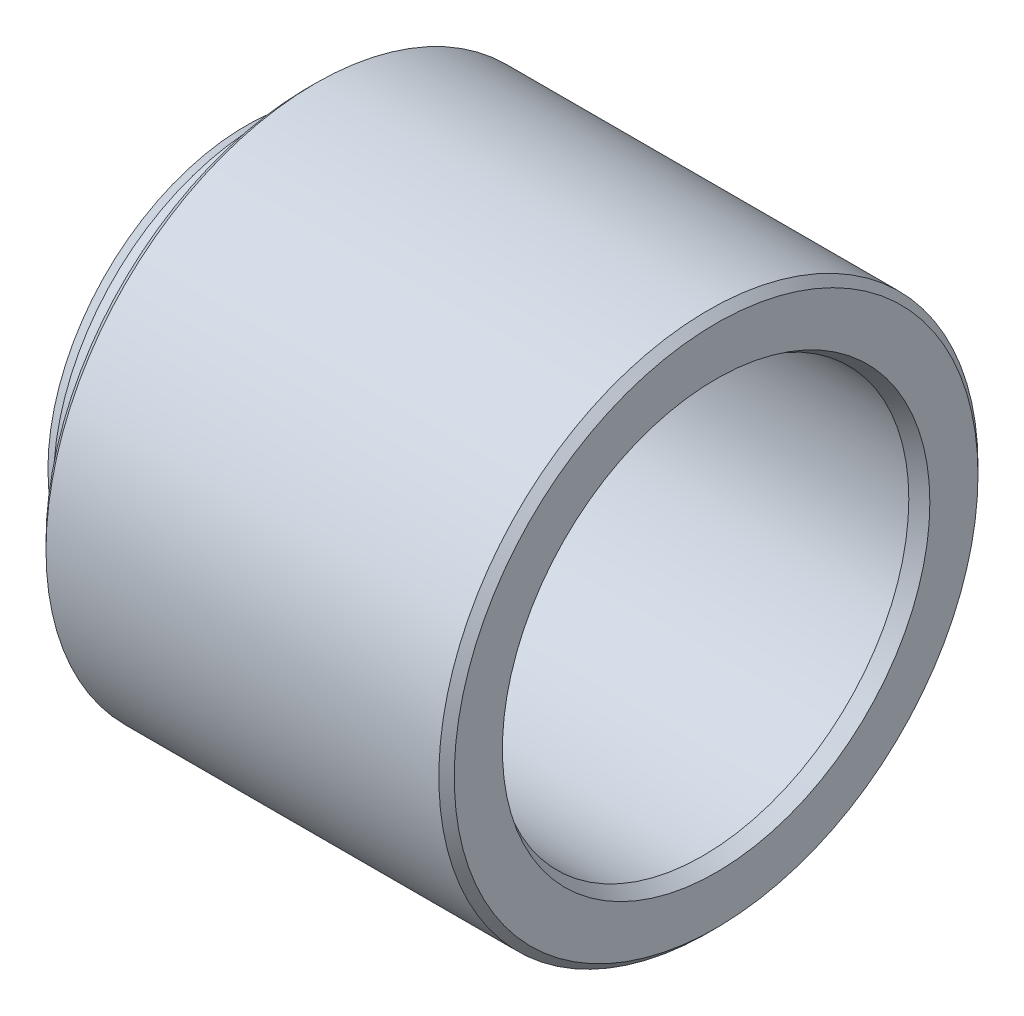
ISO-10303-21;
HEADER;
FILE_DESCRIPTION(('STEP AP214'),'2;1');
FILE_NAME('part.step','',(''),(''),'','','');
FILE_SCHEMA(('AUTOMOTIVE_DESIGN { 1 0 10303 214 1 1 1 1 }'));
ENDSEC;
DATA;
#1=APPLICATION_CONTEXT('core data for automotive mechanical design processes');
#2=APPLICATION_PROTOCOL_DEFINITION('international standard','automotive_design',2000,#1);
#3=PRODUCT_CONTEXT('',#1,'mechanical');
#4=PRODUCT('Part','Part','',(#3));
#5=PRODUCT_RELATED_PRODUCT_CATEGORY('part','',(#4));
#6=PRODUCT_DEFINITION_FORMATION('','',#4);
#7=PRODUCT_DEFINITION_CONTEXT('part definition',#1,'design');
#8=PRODUCT_DEFINITION('design','',#6,#7);
#9=PRODUCT_DEFINITION_SHAPE('','',#8);
#10=(LENGTH_UNIT() NAMED_UNIT(*) SI_UNIT(.MILLI.,.METRE.));
#11=(NAMED_UNIT(*) PLANE_ANGLE_UNIT() SI_UNIT($,.RADIAN.));
#12=(NAMED_UNIT(*) SI_UNIT($,.STERADIAN.) SOLID_ANGLE_UNIT());
#13=UNCERTAINTY_MEASURE_WITH_UNIT(LENGTH_MEASURE(1.E-05),#10,'distance_accuracy_value','');
#14=(GEOMETRIC_REPRESENTATION_CONTEXT(3) GLOBAL_UNCERTAINTY_ASSIGNED_CONTEXT((#13)) GLOBAL_UNIT_ASSIGNED_CONTEXT((#10,
#11,#12)) REPRESENTATION_CONTEXT('',''));
#15=CARTESIAN_POINT('',(0.,0.,0.));
#16=DIRECTION('',(0.,0.,1.));
#17=DIRECTION('',(1.,0.,0.));
#18=AXIS2_PLACEMENT_3D('',#15,#16,#17);
#19=CARTESIAN_POINT('',(0.,8.89,0.));
#20=DIRECTION('',(1.,0.,0.));
#21=DIRECTION('',(0.,0.,-1.));
#22=AXIS2_PLACEMENT_3D('',#19,#20,#21);
#23=PLANE('',#22);
#24=CARTESIAN_POINT('',(0.,0.,0.));
#25=DIRECTION('',(1.,0.,0.));
#26=DIRECTION('',(0.,0.,-1.));
#27=AXIS2_PLACEMENT_3D('',#24,#25,#26);
#28=CIRCLE('',#27,7.0485);
#29=CARTESIAN_POINT('',(0.,0.,-7.0485));
#30=VERTEX_POINT('',#29);
#31=EDGE_CURVE('E25',#30,#30,#28,.F.);
#32=ORIENTED_EDGE('',*,*,#31,.T.);
#33=EDGE_LOOP('',(#32));
#34=FACE_BOUND('',#33,.T.);
#35=CARTESIAN_POINT('',(0.,0.,0.));
#36=DIRECTION('',(1.,0.,0.));
#37=DIRECTION('',(0.,0.,-1.));
#38=AXIS2_PLACEMENT_3D('',#35,#36,#37);
#39=CIRCLE('',#38,8.63599999999999);
#40=CARTESIAN_POINT('',(0.,0.,-8.63599999999999));
#41=VERTEX_POINT('',#40);
#42=EDGE_CURVE('E34',#41,#41,#39,.T.);
#43=ORIENTED_EDGE('',*,*,#42,.T.);
#44=EDGE_LOOP('',(#43));
#45=FACE_BOUND('',#44,.T.);
#46=ADVANCED_FACE('F14',(#34,#45),#23,.T.);
#47=CARTESIAN_POINT('',(0.,0.,0.));
#48=DIRECTION('',(1.,0.,0.));
#49=DIRECTION('',(0.,0.,-1.));
#50=AXIS2_PLACEMENT_3D('',#47,#48,#49);
#51=CYLINDRICAL_SURFACE('',#50,8.89);
#52=CARTESIAN_POINT('',(-13.208,0.,0.));
#53=DIRECTION('',(-1.,0.,0.));
#54=DIRECTION('',(0.,0.,1.));
#55=AXIS2_PLACEMENT_3D('',#52,#53,#54);
#56=CIRCLE('',#55,8.89);
#57=CARTESIAN_POINT('',(-13.208,0.,8.89));
#58=VERTEX_POINT('',#57);
#59=EDGE_CURVE('E40',#58,#58,#56,.F.);
#60=ORIENTED_EDGE('',*,*,#59,.T.);
#61=EDGE_LOOP('',(#60));
#62=FACE_BOUND('',#61,.T.);
#63=CARTESIAN_POINT('',(-0.254000000000006,0.,0.));
#64=DIRECTION('',(1.,0.,0.));
#65=DIRECTION('',(0.,0.,-1.));
#66=AXIS2_PLACEMENT_3D('',#63,#64,#65);
#67=CIRCLE('',#66,8.89);
#68=CARTESIAN_POINT('',(-0.254000000000006,0.,-8.89));
#69=VERTEX_POINT('',#68);
#70=EDGE_CURVE('E43',#69,#69,#67,.F.);
#71=ORIENTED_EDGE('',*,*,#70,.T.);
#72=EDGE_LOOP('',(#71));
#73=FACE_BOUND('',#72,.T.);
#74=ADVANCED_FACE('F93',(#62,#73),#51,.T.);
#75=CARTESIAN_POINT('',(-13.462,8.89,0.));
#76=DIRECTION('',(-1.,0.,0.));
#77=DIRECTION('',(0.,0.,1.));
#78=AXIS2_PLACEMENT_3D('',#75,#76,#77);
#79=PLANE('',#78);
#80=CARTESIAN_POINT('',(-13.462,0.,0.));
#81=DIRECTION('',(-1.,0.,0.));
#82=DIRECTION('',(0.,0.,1.));
#83=AXIS2_PLACEMENT_3D('',#80,#81,#82);
#84=CIRCLE('',#83,8.636);
#85=CARTESIAN_POINT('',(-13.462,0.,8.636));
#86=VERTEX_POINT('',#85);
#87=EDGE_CURVE('E37',#86,#86,#84,.T.);
#88=ORIENTED_EDGE('',*,*,#87,.T.);
#89=EDGE_LOOP('',(#88));
#90=FACE_BOUND('',#89,.T.);
#91=CARTESIAN_POINT('',(-13.462,0.,0.));
#92=DIRECTION('',(1.,0.,0.));
#93=DIRECTION('',(0.,0.,-1.));
#94=AXIS2_PLACEMENT_3D('',#91,#92,#93);
#95=CIRCLE('',#94,6.4135);
#96=CARTESIAN_POINT('',(-13.462,0.,-6.4135));
#97=VERTEX_POINT('',#96);
#98=EDGE_CURVE('E52',#97,#97,#95,.T.);
#99=ORIENTED_EDGE('',*,*,#98,.T.);
#100=EDGE_LOOP('',(#99));
#101=FACE_BOUND('',#100,.T.);
#102=ADVANCED_FACE('F99',(#90,#101),#79,.T.);
#103=CARTESIAN_POINT('',(0.,0.,0.));
#104=DIRECTION('',(1.,0.,0.));
#105=DIRECTION('',(0.,0.,-1.));
#106=AXIS2_PLACEMENT_3D('',#103,#104,#105);
#107=CYLINDRICAL_SURFACE('',#106,6.4135);
#108=CARTESIAN_POINT('',(-13.843,0.,0.));
#109=DIRECTION('',(1.,0.,0.));
#110=DIRECTION('',(0.,0.,-1.));
#111=AXIS2_PLACEMENT_3D('',#108,#109,#110);
#112=CIRCLE('',#111,6.41349999999999);
#113=CARTESIAN_POINT('',(-13.843,0.,-6.41349999999999));
#114=VERTEX_POINT('',#113);
#115=EDGE_CURVE('E55',#114,#114,#112,.T.);
#116=ORIENTED_EDGE('',*,*,#115,.T.);
#117=EDGE_LOOP('',(#116));
#118=FACE_BOUND('',#117,.T.);
#119=ORIENTED_EDGE('',*,*,#98,.F.);
#120=EDGE_LOOP('',(#119));
#121=FACE_BOUND('',#120,.T.);
#122=ADVANCED_FACE('F226',(#118,#121),#107,.T.);
#123=CARTESIAN_POINT('',(-13.843,0.,0.));
#124=DIRECTION('',(-1.,0.,0.));
#125=DIRECTION('',(0.,0.,1.));
#126=AXIS2_PLACEMENT_3D('',#123,#124,#125);
#127=CONICAL_SURFACE('',#126,6.41349999999999,1.0471975511966);
#128=CARTESIAN_POINT('',(-14.0629704525613,0.,0.));
#129=DIRECTION('',(1.,0.,0.));
#130=DIRECTION('',(0.,0.,-1.));
#131=AXIS2_PLACEMENT_3D('',#128,#129,#130);
#132=CIRCLE('',#131,6.7945);
#133=CARTESIAN_POINT('',(-14.0629704525613,0.,-6.7945));
#134=VERTEX_POINT('',#133);
#135=EDGE_CURVE('E58',#134,#134,#132,.T.);
#136=ORIENTED_EDGE('',*,*,#135,.T.);
#137=EDGE_LOOP('',(#136));
#138=FACE_BOUND('',#137,.T.);
#139=ORIENTED_EDGE('',*,*,#115,.F.);
#140=EDGE_LOOP('',(#139));
#141=FACE_BOUND('',#140,.T.);
#142=ADVANCED_FACE('F218',(#138,#141),#127,.T.);
#143=CARTESIAN_POINT('',(0.,0.,0.));
#144=DIRECTION('',(1.,0.,0.));
#145=DIRECTION('',(0.,0.,-1.));
#146=AXIS2_PLACEMENT_3D('',#143,#144,#145);
#147=CYLINDRICAL_SURFACE('',#146,6.7945);
#148=CARTESIAN_POINT('',(-15.0540590948775,0.,0.));
#149=DIRECTION('',(-1.,0.,0.));
#150=DIRECTION('',(0.,0.,1.));
#151=AXIS2_PLACEMENT_3D('',#148,#149,#150);
#152=CIRCLE('',#151,6.7945);
#153=CARTESIAN_POINT('',(-15.0540590948775,0.,6.7945));
#154=VERTEX_POINT('',#153);
#155=EDGE_CURVE('E21',#154,#154,#152,.F.);
#156=ORIENTED_EDGE('',*,*,#155,.T.);
#157=EDGE_LOOP('',(#156));
#158=FACE_BOUND('',#157,.T.);
#159=ORIENTED_EDGE('',*,*,#135,.F.);
#160=EDGE_LOOP('',(#159));
#161=FACE_BOUND('',#160,.T.);
#162=ADVANCED_FACE('F210',(#158,#161),#147,.T.);
#163=CARTESIAN_POINT('',(-15.494,6.7945,0.));
#164=DIRECTION('',(-1.,0.,0.));
#165=DIRECTION('',(0.,0.,1.));
#166=AXIS2_PLACEMENT_3D('',#163,#164,#165);
#167=PLANE('',#166);
#168=CARTESIAN_POINT('',(-15.494,0.,0.));
#169=DIRECTION('',(-1.,0.,0.));
#170=DIRECTION('',(0.,0.,1.));
#171=AXIS2_PLACEMENT_3D('',#168,#169,#170);
#172=CIRCLE('',#171,6.5405);
#173=CARTESIAN_POINT('',(-15.494,0.,6.5405));
#174=VERTEX_POINT('',#173);
#175=EDGE_CURVE('E10',#174,#174,#172,.T.);
#176=ORIENTED_EDGE('',*,*,#175,.T.);
#177=EDGE_LOOP('',(#176));
#178=FACE_BOUND('',#177,.T.);
#179=CARTESIAN_POINT('',(-15.494,0.,0.));
#180=DIRECTION('',(-1.,0.,0.));
#181=DIRECTION('',(0.,0.,1.));
#182=AXIS2_PLACEMENT_3D('',#179,#180,#181);
#183=CIRCLE('',#182,5.969);
#184=CARTESIAN_POINT('',(-15.494,0.,5.969));
#185=VERTEX_POINT('',#184);
#186=EDGE_CURVE('E49',#185,#185,#183,.F.);
#187=ORIENTED_EDGE('',*,*,#186,.T.);
#188=EDGE_LOOP('',(#187));
#189=FACE_BOUND('',#188,.T.);
#190=ADVANCED_FACE('F200',(#178,#189),#167,.T.);
#191=CARTESIAN_POINT('',(0.,0.,0.));
#192=DIRECTION('',(1.,0.,0.));
#193=DIRECTION('',(0.,0.,-1.));
#194=AXIS2_PLACEMENT_3D('',#191,#192,#193);
#195=CYLINDRICAL_SURFACE('',#194,5.715);
#196=CARTESIAN_POINT('',(-15.24,0.,0.));
#197=DIRECTION('',(-1.,0.,0.));
#198=DIRECTION('',(0.,0.,1.));
#199=AXIS2_PLACEMENT_3D('',#196,#197,#198);
#200=CIRCLE('',#199,5.715);
#201=CARTESIAN_POINT('',(-15.24,0.,5.715));
#202=VERTEX_POINT('',#201);
#203=EDGE_CURVE('E46',#202,#202,#200,.T.);
#204=ORIENTED_EDGE('',*,*,#203,.T.);
#205=EDGE_LOOP('',(#204));
#206=FACE_BOUND('',#205,.T.);
#207=CARTESIAN_POINT('',(-12.7,0.,0.));
#208=DIRECTION('',(1.,0.,0.));
#209=DIRECTION('',(0.,0.,-1.));
#210=AXIS2_PLACEMENT_3D('',#207,#208,#209);
#211=CIRCLE('',#210,5.715);
#212=CARTESIAN_POINT('',(-12.7,0.,-5.715));
#213=VERTEX_POINT('',#212);
#214=EDGE_CURVE('E61',#213,#213,#211,.T.);
#215=ORIENTED_EDGE('',*,*,#214,.T.);
#216=EDGE_LOOP('',(#215));
#217=FACE_BOUND('',#216,.T.);
#218=ADVANCED_FACE('F189',(#206,#217),#195,.F.);
#219=CARTESIAN_POINT('',(-12.7,5.715,0.));
#220=DIRECTION('',(1.,0.,0.));
#221=DIRECTION('',(0.,0.,-1.));
#222=AXIS2_PLACEMENT_3D('',#219,#220,#221);
#223=PLANE('',#222);
#224=CARTESIAN_POINT('',(-12.7,0.,0.));
#225=DIRECTION('',(1.,0.,0.));
#226=DIRECTION('',(0.,0.,-1.));
#227=AXIS2_PLACEMENT_3D('',#224,#225,#226);
#228=CIRCLE('',#227,7.1755);
#229=CARTESIAN_POINT('',(-12.7,0.,-7.1755));
#230=VERTEX_POINT('',#229);
#231=EDGE_CURVE('E64',#230,#230,#228,.T.);
#232=ORIENTED_EDGE('',*,*,#231,.T.);
#233=EDGE_LOOP('',(#232));
#234=FACE_BOUND('',#233,.T.);
#235=ORIENTED_EDGE('',*,*,#214,.F.);
#236=EDGE_LOOP('',(#235));
#237=FACE_BOUND('',#236,.T.);
#238=ADVANCED_FACE('F178',(#234,#237),#223,.T.);
#239=CARTESIAN_POINT('',(0.,0.,0.));
#240=DIRECTION('',(1.,0.,0.));
#241=DIRECTION('',(0.,0.,-1.));
#242=AXIS2_PLACEMENT_3D('',#239,#240,#241);
#243=CYLINDRICAL_SURFACE('',#242,7.1755);
#244=CARTESIAN_POINT('',(-12.319,0.,0.));
#245=DIRECTION('',(1.,0.,0.));
#246=DIRECTION('',(0.,0.,-1.));
#247=AXIS2_PLACEMENT_3D('',#244,#245,#246);
#248=CIRCLE('',#247,7.1755);
#249=CARTESIAN_POINT('',(-12.319,0.,-7.1755));
#250=VERTEX_POINT('',#249);
#251=EDGE_CURVE('E67',#250,#250,#248,.T.);
#252=ORIENTED_EDGE('',*,*,#251,.T.);
#253=EDGE_LOOP('',(#252));
#254=FACE_BOUND('',#253,.T.);
#255=ORIENTED_EDGE('',*,*,#231,.F.);
#256=EDGE_LOOP('',(#255));
#257=FACE_BOUND('',#256,.T.);
#258=ADVANCED_FACE('F90',(#254,#257),#243,.F.);
#259=CARTESIAN_POINT('',(-12.319,7.1755,0.));
#260=DIRECTION('',(-1.,0.,0.));
#261=DIRECTION('',(0.,0.,1.));
#262=AXIS2_PLACEMENT_3D('',#259,#260,#261);
#263=PLANE('',#262);
#264=CARTESIAN_POINT('',(-12.319,0.,0.));
#265=DIRECTION('',(1.,0.,0.));
#266=DIRECTION('',(0.,0.,-1.));
#267=AXIS2_PLACEMENT_3D('',#264,#265,#266);
#268=CIRCLE('',#267,6.7945);
#269=CARTESIAN_POINT('',(-12.319,0.,-6.7945));
#270=VERTEX_POINT('',#269);
#271=EDGE_CURVE('E70',#270,#270,#268,.T.);
#272=ORIENTED_EDGE('',*,*,#271,.T.);
#273=EDGE_LOOP('',(#272));
#274=FACE_BOUND('',#273,.T.);
#275=ORIENTED_EDGE('',*,*,#251,.F.);
#276=EDGE_LOOP('',(#275));
#277=FACE_BOUND('',#276,.T.);
#278=ADVANCED_FACE('F74',(#274,#277),#263,.T.);
#279=CARTESIAN_POINT('',(0.,0.,0.));
#280=DIRECTION('',(1.,0.,0.));
#281=DIRECTION('',(0.,0.,-1.));
#282=AXIS2_PLACEMENT_3D('',#279,#280,#281);
#283=CYLINDRICAL_SURFACE('',#282,6.7945);
#284=CARTESIAN_POINT('',(-0.439940905122496,0.,0.));
#285=DIRECTION('',(1.,0.,0.));
#286=DIRECTION('',(0.,0.,-1.));
#287=AXIS2_PLACEMENT_3D('',#284,#285,#286);
#288=CIRCLE('',#287,6.7945);
#289=CARTESIAN_POINT('',(-0.439940905122496,0.,-6.7945));
#290=VERTEX_POINT('',#289);
#291=EDGE_CURVE('E29',#290,#290,#288,.T.);
#292=ORIENTED_EDGE('',*,*,#291,.T.);
#293=EDGE_LOOP('',(#292));
#294=FACE_BOUND('',#293,.T.);
#295=ORIENTED_EDGE('',*,*,#271,.F.);
#296=EDGE_LOOP('',(#295));
#297=FACE_BOUND('',#296,.T.);
#298=ADVANCED_FACE('F77',(#294,#297),#283,.F.);
#299=CARTESIAN_POINT('',(-15.494,0.,0.));
#300=DIRECTION('',(-1.,0.,0.));
#301=DIRECTION('',(0.,0.,1.));
#302=AXIS2_PLACEMENT_3D('',#299,#300,#301);
#303=CONICAL_SURFACE('',#302,5.969,0.785398163397443);
#304=ORIENTED_EDGE('',*,*,#203,.F.);
#305=EDGE_LOOP('',(#304));
#306=FACE_BOUND('',#305,.T.);
#307=ORIENTED_EDGE('',*,*,#186,.F.);
#308=EDGE_LOOP('',(#307));
#309=FACE_BOUND('',#308,.T.);
#310=ADVANCED_FACE('F79',(#306,#309),#303,.F.);
#311=CARTESIAN_POINT('',(-13.208,0.,0.));
#312=DIRECTION('',(1.,0.,0.));
#313=DIRECTION('',(0.,0.,-1.));
#314=AXIS2_PLACEMENT_3D('',#311,#312,#313);
#315=CONICAL_SURFACE('',#314,8.89,0.785398163397455);
#316=ORIENTED_EDGE('',*,*,#87,.F.);
#317=EDGE_LOOP('',(#316));
#318=FACE_BOUND('',#317,.T.);
#319=ORIENTED_EDGE('',*,*,#59,.F.);
#320=EDGE_LOOP('',(#319));
#321=FACE_BOUND('',#320,.T.);
#322=ADVANCED_FACE('F87',(#318,#321),#315,.T.);
#323=CARTESIAN_POINT('',(0.,0.,0.));
#324=DIRECTION('',(-1.,0.,0.));
#325=DIRECTION('',(0.,0.,1.));
#326=AXIS2_PLACEMENT_3D('',#323,#324,#325);
#327=CONICAL_SURFACE('',#326,8.63599999999999,0.785398163397445);
#328=ORIENTED_EDGE('',*,*,#70,.F.);
#329=EDGE_LOOP('',(#328));
#330=FACE_BOUND('',#329,.T.);
#331=ORIENTED_EDGE('',*,*,#42,.F.);
#332=EDGE_LOOP('',(#331));
#333=FACE_BOUND('',#332,.T.);
#334=ADVANCED_FACE('F107',(#330,#333),#327,.T.);
#335=CARTESIAN_POINT('',(-0.439940905122496,0.,0.));
#336=DIRECTION('',(1.,0.,0.));
#337=DIRECTION('',(0.,0.,-1.));
#338=AXIS2_PLACEMENT_3D('',#335,#336,#337);
#339=CONICAL_SURFACE('',#338,6.7945,0.523598775598302);
#340=ORIENTED_EDGE('',*,*,#31,.F.);
#341=EDGE_LOOP('',(#340));
#342=FACE_BOUND('',#341,.T.);
#343=ORIENTED_EDGE('',*,*,#291,.F.);
#344=EDGE_LOOP('',(#343));
#345=FACE_BOUND('',#344,.T.);
#346=ADVANCED_FACE('F110',(#342,#345),#339,.F.);
#347=CARTESIAN_POINT('',(-15.0540590948775,0.,0.));
#348=DIRECTION('',(1.,0.,0.));
#349=DIRECTION('',(0.,0.,-1.));
#350=AXIS2_PLACEMENT_3D('',#347,#348,#349);
#351=CONICAL_SURFACE('',#350,6.7945,0.523598775598303);
#352=ORIENTED_EDGE('',*,*,#175,.F.);
#353=EDGE_LOOP('',(#352));
#354=FACE_BOUND('',#353,.T.);
#355=ORIENTED_EDGE('',*,*,#155,.F.);
#356=EDGE_LOOP('',(#355));
#357=FACE_BOUND('',#356,.T.);
#358=ADVANCED_FACE('F16',(#354,#357),#351,.T.);
#359=CLOSED_SHELL('',(#46,#74,#102,#122,#142,#162,#190,#218,#238,#258,#278,#298,#310,#322,#334,
#346,#358));
#360=MANIFOLD_SOLID_BREP('B1',#359);
#361=ADVANCED_BREP_SHAPE_REPRESENTATION('',(#18,#360),#14);
#362=SHAPE_DEFINITION_REPRESENTATION(#9,#361);
ENDSEC;
END-ISO-10303-21;
